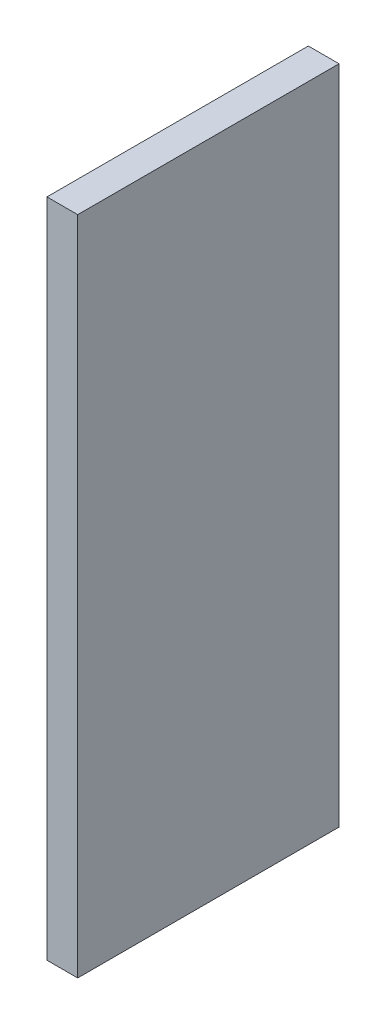
ISO-10303-21;
HEADER;
FILE_DESCRIPTION(('STEP AP214'),'2;1');
FILE_NAME('part.step','',(''),(''),'','','');
FILE_SCHEMA(('AUTOMOTIVE_DESIGN { 1 0 10303 214 1 1 1 1 }'));
ENDSEC;
DATA;
#1=APPLICATION_CONTEXT('core data for automotive mechanical design processes');
#2=APPLICATION_PROTOCOL_DEFINITION('international standard','automotive_design',2000,#1);
#3=PRODUCT_CONTEXT('',#1,'mechanical');
#4=PRODUCT('Part','Part','',(#3));
#5=PRODUCT_RELATED_PRODUCT_CATEGORY('part','',(#4));
#6=PRODUCT_DEFINITION_FORMATION('','',#4);
#7=PRODUCT_DEFINITION_CONTEXT('part definition',#1,'design');
#8=PRODUCT_DEFINITION('design','',#6,#7);
#9=PRODUCT_DEFINITION_SHAPE('','',#8);
#10=(LENGTH_UNIT() NAMED_UNIT(*) SI_UNIT(.MILLI.,.METRE.));
#11=(NAMED_UNIT(*) PLANE_ANGLE_UNIT() SI_UNIT($,.RADIAN.));
#12=(NAMED_UNIT(*) SI_UNIT($,.STERADIAN.) SOLID_ANGLE_UNIT());
#13=UNCERTAINTY_MEASURE_WITH_UNIT(LENGTH_MEASURE(1.E-05),#10,'distance_accuracy_value','');
#14=(GEOMETRIC_REPRESENTATION_CONTEXT(3) GLOBAL_UNCERTAINTY_ASSIGNED_CONTEXT((#13)) GLOBAL_UNIT_ASSIGNED_CONTEXT((#10,
#11,#12)) REPRESENTATION_CONTEXT('',''));
#15=CARTESIAN_POINT('',(0.,0.,0.));
#16=DIRECTION('',(0.,0.,1.));
#17=DIRECTION('',(1.,0.,0.));
#18=AXIS2_PLACEMENT_3D('',#15,#16,#17);
#19=CARTESIAN_POINT('',(5.,107.5,-42.5));
#20=DIRECTION('',(0.,-1.,0.));
#21=DIRECTION('',(0.,0.,-1.));
#22=AXIS2_PLACEMENT_3D('',#19,#20,#21);
#23=PLANE('',#22);
#24=DIRECTION('',(0.,0.,1.));
#25=VECTOR('',#24,1.);
#26=CARTESIAN_POINT('',(-5.,107.5,-42.5));
#27=LINE('',#26,#25);
#28=CARTESIAN_POINT('',(-5.,107.5,-42.5));
#29=VERTEX_POINT('',#28);
#30=CARTESIAN_POINT('',(-5.,107.5,42.5));
#31=VERTEX_POINT('',#30);
#32=EDGE_CURVE('E105',#29,#31,#27,.T.);
#33=ORIENTED_EDGE('',*,*,#32,.T.);
#34=DIRECTION('',(-1.,0.,0.));
#35=VECTOR('',#34,1.);
#36=CARTESIAN_POINT('',(5.,107.5,42.5));
#37=LINE('',#36,#35);
#38=CARTESIAN_POINT('',(5.,107.5,42.5));
#39=VERTEX_POINT('',#38);
#40=EDGE_CURVE('E11',#39,#31,#37,.T.);
#41=ORIENTED_EDGE('',*,*,#40,.F.);
#42=DIRECTION('',(0.,0.,1.));
#43=VECTOR('',#42,1.);
#44=CARTESIAN_POINT('',(5.,107.5,-42.5));
#45=LINE('',#44,#43);
#46=CARTESIAN_POINT('',(5.,107.5,-42.5));
#47=VERTEX_POINT('',#46);
#48=EDGE_CURVE('E93',#47,#39,#45,.T.);
#49=ORIENTED_EDGE('',*,*,#48,.F.);
#50=DIRECTION('',(-1.,0.,0.));
#51=VECTOR('',#50,1.);
#52=CARTESIAN_POINT('',(5.,107.5,-42.5));
#53=LINE('',#52,#51);
#54=EDGE_CURVE('E101',#47,#29,#53,.T.);
#55=ORIENTED_EDGE('',*,*,#54,.T.);
#56=EDGE_LOOP('',(#33,#41,#49,#55));
#57=FACE_BOUND('',#56,.T.);
#58=ADVANCED_FACE('F42',(#57),#23,.F.);
#59=CARTESIAN_POINT('',(5.,-107.5,42.5));
#60=DIRECTION('',(0.,0.,-1.));
#61=DIRECTION('',(-1.,0.,0.));
#62=AXIS2_PLACEMENT_3D('',#59,#60,#61);
#63=PLANE('',#62);
#64=DIRECTION('',(0.,-1.,0.));
#65=VECTOR('',#64,1.);
#66=CARTESIAN_POINT('',(-5.,-107.5,42.5));
#67=LINE('',#66,#65);
#68=CARTESIAN_POINT('',(-5.,-107.5,42.5));
#69=VERTEX_POINT('',#68);
#70=EDGE_CURVE('E97',#31,#69,#67,.T.);
#71=ORIENTED_EDGE('',*,*,#70,.T.);
#72=DIRECTION('',(-1.,0.,0.));
#73=VECTOR('',#72,1.);
#74=CARTESIAN_POINT('',(5.,-107.5,42.5));
#75=LINE('',#74,#73);
#76=CARTESIAN_POINT('',(5.,-107.5,42.5));
#77=VERTEX_POINT('',#76);
#78=EDGE_CURVE('E50',#77,#69,#75,.T.);
#79=ORIENTED_EDGE('',*,*,#78,.F.);
#80=DIRECTION('',(0.,-1.,0.));
#81=VECTOR('',#80,1.);
#82=CARTESIAN_POINT('',(5.,-107.5,42.5));
#83=LINE('',#82,#81);
#84=EDGE_CURVE('E88',#39,#77,#83,.T.);
#85=ORIENTED_EDGE('',*,*,#84,.F.);
#86=ORIENTED_EDGE('',*,*,#40,.T.);
#87=EDGE_LOOP('',(#71,#79,#85,#86));
#88=FACE_BOUND('',#87,.T.);
#89=ADVANCED_FACE('F96',(#88),#63,.F.);
#90=CARTESIAN_POINT('',(5.,-107.5,-42.5));
#91=DIRECTION('',(0.,1.,0.));
#92=DIRECTION('',(0.,0.,1.));
#93=AXIS2_PLACEMENT_3D('',#90,#91,#92);
#94=PLANE('',#93);
#95=DIRECTION('',(0.,0.,-1.));
#96=VECTOR('',#95,1.);
#97=CARTESIAN_POINT('',(-5.,-107.5,-42.5));
#98=LINE('',#97,#96);
#99=CARTESIAN_POINT('',(-5.,-107.5,-42.5));
#100=VERTEX_POINT('',#99);
#101=EDGE_CURVE('E75',#69,#100,#98,.T.);
#102=ORIENTED_EDGE('',*,*,#101,.T.);
#103=DIRECTION('',(-1.,0.,0.));
#104=VECTOR('',#103,1.);
#105=CARTESIAN_POINT('',(5.,-107.5,-42.5));
#106=LINE('',#105,#104);
#107=CARTESIAN_POINT('',(5.,-107.5,-42.5));
#108=VERTEX_POINT('',#107);
#109=EDGE_CURVE('E98',#108,#100,#106,.T.);
#110=ORIENTED_EDGE('',*,*,#109,.F.);
#111=DIRECTION('',(0.,0.,-1.));
#112=VECTOR('',#111,1.);
#113=CARTESIAN_POINT('',(5.,-107.5,-42.5));
#114=LINE('',#113,#112);
#115=EDGE_CURVE('E91',#77,#108,#114,.T.);
#116=ORIENTED_EDGE('',*,*,#115,.F.);
#117=ORIENTED_EDGE('',*,*,#78,.T.);
#118=EDGE_LOOP('',(#102,#110,#116,#117));
#119=FACE_BOUND('',#118,.T.);
#120=ADVANCED_FACE('F99',(#119),#94,.F.);
#121=CARTESIAN_POINT('',(5.,-107.5,-42.5));
#122=DIRECTION('',(0.,0.,1.));
#123=DIRECTION('',(1.,0.,0.));
#124=AXIS2_PLACEMENT_3D('',#121,#122,#123);
#125=PLANE('',#124);
#126=DIRECTION('',(0.,1.,0.));
#127=VECTOR('',#126,1.);
#128=CARTESIAN_POINT('',(-5.,-107.5,-42.5));
#129=LINE('',#128,#127);
#130=EDGE_CURVE('E81',#100,#29,#129,.T.);
#131=ORIENTED_EDGE('',*,*,#130,.T.);
#132=ORIENTED_EDGE('',*,*,#54,.F.);
#133=DIRECTION('',(0.,1.,0.));
#134=VECTOR('',#133,1.);
#135=CARTESIAN_POINT('',(5.,-107.5,-42.5));
#136=LINE('',#135,#134);
#137=EDGE_CURVE('E58',#108,#47,#136,.T.);
#138=ORIENTED_EDGE('',*,*,#137,.F.);
#139=ORIENTED_EDGE('',*,*,#109,.T.);
#140=EDGE_LOOP('',(#131,#132,#138,#139));
#141=FACE_BOUND('',#140,.T.);
#142=ADVANCED_FACE('F112',(#141),#125,.F.);
#143=CARTESIAN_POINT('',(5.,0.,0.));
#144=DIRECTION('',(-1.,0.,0.));
#145=DIRECTION('',(0.,0.,1.));
#146=AXIS2_PLACEMENT_3D('',#143,#144,#145);
#147=PLANE('',#146);
#148=ORIENTED_EDGE('',*,*,#48,.T.);
#149=ORIENTED_EDGE('',*,*,#84,.T.);
#150=ORIENTED_EDGE('',*,*,#115,.T.);
#151=ORIENTED_EDGE('',*,*,#137,.T.);
#152=EDGE_LOOP('',(#148,#149,#150,#151));
#153=FACE_BOUND('',#152,.T.);
#154=ADVANCED_FACE('F89',(#153),#147,.F.);
#155=CARTESIAN_POINT('',(-5.,0.,0.));
#156=DIRECTION('',(-1.,0.,0.));
#157=DIRECTION('',(0.,0.,1.));
#158=AXIS2_PLACEMENT_3D('',#155,#156,#157);
#159=PLANE('',#158);
#160=ORIENTED_EDGE('',*,*,#32,.F.);
#161=ORIENTED_EDGE('',*,*,#130,.F.);
#162=ORIENTED_EDGE('',*,*,#101,.F.);
#163=ORIENTED_EDGE('',*,*,#70,.F.);
#164=EDGE_LOOP('',(#160,#161,#162,#163));
#165=FACE_BOUND('',#164,.T.);
#166=ADVANCED_FACE('F115',(#165),#159,.T.);
#167=CLOSED_SHELL('',(#58,#89,#120,#142,#154,#166));
#168=MANIFOLD_SOLID_BREP('B2',#167);
#169=ADVANCED_BREP_SHAPE_REPRESENTATION('',(#18,#168),#14);
#170=SHAPE_DEFINITION_REPRESENTATION(#9,#169);
ENDSEC;
END-ISO-10303-21;
